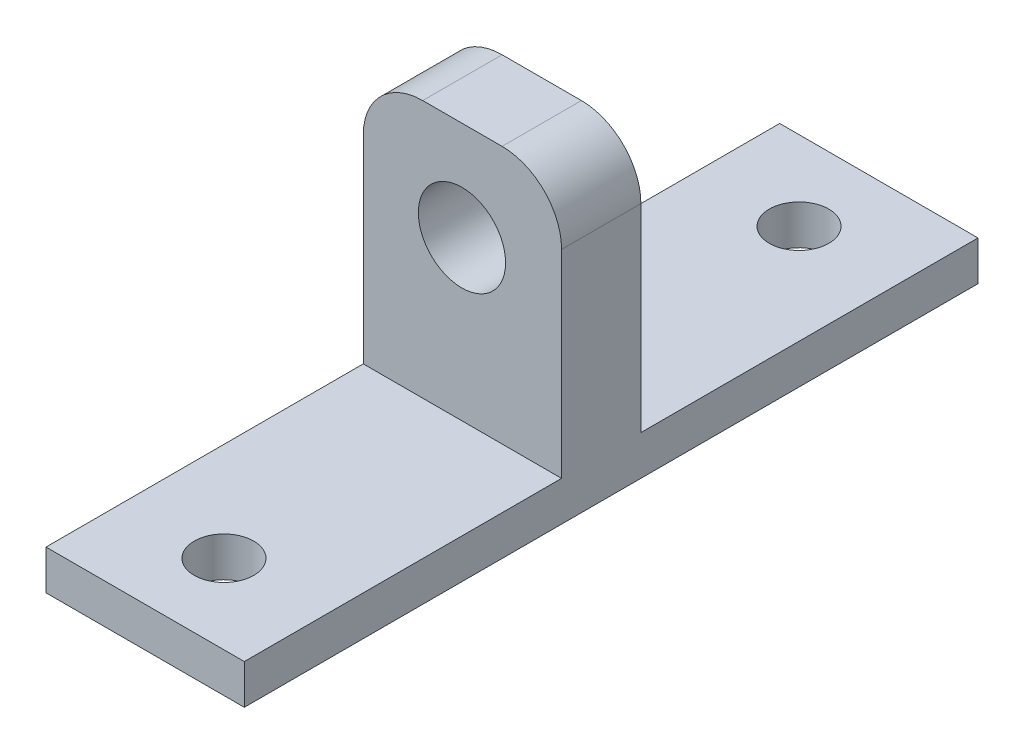
ISO-10303-21;
HEADER;
FILE_DESCRIPTION(('STEP AP214'),'2;1');
FILE_NAME('part.step','',(''),(''),'','','');
FILE_SCHEMA(('AUTOMOTIVE_DESIGN { 1 0 10303 214 1 1 1 1 }'));
ENDSEC;
DATA;
#1=APPLICATION_CONTEXT('core data for automotive mechanical design processes');
#2=APPLICATION_PROTOCOL_DEFINITION('international standard','automotive_design',2000,#1);
#3=PRODUCT_CONTEXT('',#1,'mechanical');
#4=PRODUCT('Part','Part','',(#3));
#5=PRODUCT_RELATED_PRODUCT_CATEGORY('part','',(#4));
#6=PRODUCT_DEFINITION_FORMATION('','',#4);
#7=PRODUCT_DEFINITION_CONTEXT('part definition',#1,'design');
#8=PRODUCT_DEFINITION('design','',#6,#7);
#9=PRODUCT_DEFINITION_SHAPE('','',#8);
#10=(LENGTH_UNIT() NAMED_UNIT(*) SI_UNIT(.MILLI.,.METRE.));
#11=(NAMED_UNIT(*) PLANE_ANGLE_UNIT() SI_UNIT($,.RADIAN.));
#12=(NAMED_UNIT(*) SI_UNIT($,.STERADIAN.) SOLID_ANGLE_UNIT());
#13=UNCERTAINTY_MEASURE_WITH_UNIT(LENGTH_MEASURE(1.E-05),#10,'distance_accuracy_value','');
#14=(GEOMETRIC_REPRESENTATION_CONTEXT(3) GLOBAL_UNCERTAINTY_ASSIGNED_CONTEXT((#13)) GLOBAL_UNIT_ASSIGNED_CONTEXT((#10,
#11,#12)) REPRESENTATION_CONTEXT('',''));
#15=CARTESIAN_POINT('',(0.,0.,0.));
#16=DIRECTION('',(0.,0.,1.));
#17=DIRECTION('',(1.,0.,0.));
#18=AXIS2_PLACEMENT_3D('',#15,#16,#17);
#19=CARTESIAN_POINT('',(0.,0.,4.));
#20=DIRECTION('',(0.,0.,1.));
#21=DIRECTION('',(1.,0.,0.));
#22=AXIS2_PLACEMENT_3D('',#19,#20,#21);
#23=PLANE('',#22);
#24=DIRECTION('',(0.,1.,0.));
#25=VECTOR('',#24,1.);
#26=CARTESIAN_POINT('',(5.0248332971654,5.,4.));
#27=LINE('',#26,#25);
#28=CARTESIAN_POINT('',(5.0248332971654,-8.,4.));
#29=VERTEX_POINT('',#28);
#30=CARTESIAN_POINT('',(5.0248332971654,2.,4.));
#31=VERTEX_POINT('',#30);
#32=EDGE_CURVE('E170',#29,#31,#27,.T.);
#33=ORIENTED_EDGE('',*,*,#32,.T.);
#34=CARTESIAN_POINT('',(2.0248332971654,2.,4.));
#35=DIRECTION('',(0.,0.,1.));
#36=DIRECTION('',(1.,0.,0.));
#37=AXIS2_PLACEMENT_3D('',#34,#35,#36);
#38=CIRCLE('',#37,3.);
#39=CARTESIAN_POINT('',(2.0248332971654,5.,4.));
#40=VERTEX_POINT('',#39);
#41=EDGE_CURVE('E219',#31,#40,#38,.T.);
#42=ORIENTED_EDGE('',*,*,#41,.T.);
#43=DIRECTION('',(-1.,0.,0.));
#44=VECTOR('',#43,1.);
#45=CARTESIAN_POINT('',(-4.9751667028346,5.,4.));
#46=LINE('',#45,#44);
#47=CARTESIAN_POINT('',(-1.9751667028346,5.,4.));
#48=VERTEX_POINT('',#47);
#49=EDGE_CURVE('E174',#40,#48,#46,.T.);
#50=ORIENTED_EDGE('',*,*,#49,.T.);
#51=CARTESIAN_POINT('',(-1.9751667028346,2.,4.));
#52=DIRECTION('',(0.,0.,1.));
#53=DIRECTION('',(1.,0.,0.));
#54=AXIS2_PLACEMENT_3D('',#51,#52,#53);
#55=CIRCLE('',#54,3.);
#56=CARTESIAN_POINT('',(-4.9751667028346,2.,4.));
#57=VERTEX_POINT('',#56);
#58=EDGE_CURVE('E216',#48,#57,#55,.T.);
#59=ORIENTED_EDGE('',*,*,#58,.T.);
#60=DIRECTION('',(0.,-1.,0.));
#61=VECTOR('',#60,1.);
#62=CARTESIAN_POINT('',(-4.9751667028346,0.,4.));
#63=LINE('',#62,#61);
#64=CARTESIAN_POINT('',(-4.97516670283459,-8.,4.));
#65=VERTEX_POINT('',#64);
#66=EDGE_CURVE('E179',#57,#65,#63,.T.);
#67=ORIENTED_EDGE('',*,*,#66,.T.);
#68=DIRECTION('',(1.,0.,0.));
#69=VECTOR('',#68,1.);
#70=CARTESIAN_POINT('',(-4.9751667028346,-8.,4.));
#71=LINE('',#70,#69);
#72=EDGE_CURVE('E183',#65,#29,#71,.T.);
#73=ORIENTED_EDGE('',*,*,#72,.T.);
#74=EDGE_LOOP('',(#33,#42,#50,#59,#67,#73));
#75=FACE_BOUND('',#74,.T.);
#76=CARTESIAN_POINT('',(0.,0.,4.));
#77=DIRECTION('',(0.,0.,1.));
#78=DIRECTION('',(1.,0.,0.));
#79=AXIS2_PLACEMENT_3D('',#76,#77,#78);
#80=CIRCLE('',#79,2.2);
#81=CARTESIAN_POINT('',(2.2,0.,4.));
#82=VERTEX_POINT('',#81);
#83=EDGE_CURVE('E162',#82,#82,#80,.T.);
#84=ORIENTED_EDGE('',*,*,#83,.F.);
#85=EDGE_LOOP('',(#84));
#86=FACE_BOUND('',#85,.T.);
#87=ADVANCED_FACE('F44',(#75,#86),#23,.T.);
#88=CARTESIAN_POINT('',(0.,0.,0.));
#89=DIRECTION('',(0.,0.,1.));
#90=DIRECTION('',(1.,0.,0.));
#91=AXIS2_PLACEMENT_3D('',#88,#89,#90);
#92=PLANE('',#91);
#93=DIRECTION('',(-1.,0.,0.));
#94=VECTOR('',#93,1.);
#95=CARTESIAN_POINT('',(-4.9751667028346,5.,0.));
#96=LINE('',#95,#94);
#97=CARTESIAN_POINT('',(2.0248332971654,5.,0.));
#98=VERTEX_POINT('',#97);
#99=CARTESIAN_POINT('',(-1.9751667028346,5.,0.));
#100=VERTEX_POINT('',#99);
#101=EDGE_CURVE('E166',#98,#100,#96,.T.);
#102=ORIENTED_EDGE('',*,*,#101,.F.);
#103=CARTESIAN_POINT('',(2.0248332971654,2.,0.));
#104=DIRECTION('',(0.,0.,1.));
#105=DIRECTION('',(1.,0.,0.));
#106=AXIS2_PLACEMENT_3D('',#103,#104,#105);
#107=CIRCLE('',#106,3.);
#108=CARTESIAN_POINT('',(5.0248332971654,2.,0.));
#109=VERTEX_POINT('',#108);
#110=EDGE_CURVE('E210',#98,#109,#107,.F.);
#111=ORIENTED_EDGE('',*,*,#110,.T.);
#112=DIRECTION('',(0.,1.,0.));
#113=VECTOR('',#112,1.);
#114=CARTESIAN_POINT('',(5.0248332971654,-8.,0.));
#115=LINE('',#114,#113);
#116=CARTESIAN_POINT('',(5.0248332971654,-8.,0.));
#117=VERTEX_POINT('',#116);
#118=EDGE_CURVE('E175',#117,#109,#115,.T.);
#119=ORIENTED_EDGE('',*,*,#118,.F.);
#120=DIRECTION('',(1.,0.,0.));
#121=VECTOR('',#120,1.);
#122=CARTESIAN_POINT('',(-4.9751667028346,-8.,0.));
#123=LINE('',#122,#121);
#124=CARTESIAN_POINT('',(-4.97516670283459,-8.,0.));
#125=VERTEX_POINT('',#124);
#126=EDGE_CURVE('E194',#125,#117,#123,.T.);
#127=ORIENTED_EDGE('',*,*,#126,.F.);
#128=DIRECTION('',(0.,-1.,0.));
#129=VECTOR('',#128,1.);
#130=CARTESIAN_POINT('',(-4.9751667028346,0.,0.));
#131=LINE('',#130,#129);
#132=CARTESIAN_POINT('',(-4.9751667028346,2.,0.));
#133=VERTEX_POINT('',#132);
#134=EDGE_CURVE('E191',#133,#125,#131,.T.);
#135=ORIENTED_EDGE('',*,*,#134,.F.);
#136=CARTESIAN_POINT('',(-1.9751667028346,2.,0.));
#137=DIRECTION('',(0.,0.,1.));
#138=DIRECTION('',(1.,0.,0.));
#139=AXIS2_PLACEMENT_3D('',#136,#137,#138);
#140=CIRCLE('',#139,3.);
#141=EDGE_CURVE('E207',#133,#100,#140,.F.);
#142=ORIENTED_EDGE('',*,*,#141,.T.);
#143=EDGE_LOOP('',(#102,#111,#119,#127,#135,#142));
#144=FACE_BOUND('',#143,.T.);
#145=CARTESIAN_POINT('',(0.,0.,0.));
#146=DIRECTION('',(0.,0.,1.));
#147=DIRECTION('',(1.,0.,0.));
#148=AXIS2_PLACEMENT_3D('',#145,#146,#147);
#149=CIRCLE('',#148,2.2);
#150=CARTESIAN_POINT('',(2.2,0.,0.));
#151=VERTEX_POINT('',#150);
#152=EDGE_CURVE('E150',#151,#151,#149,.T.);
#153=ORIENTED_EDGE('',*,*,#152,.T.);
#154=EDGE_LOOP('',(#153));
#155=FACE_BOUND('',#154,.T.);
#156=ADVANCED_FACE('F236',(#144,#155),#92,.F.);
#157=CARTESIAN_POINT('',(-4.9751667028346,5.,4.));
#158=DIRECTION('',(0.,-1.,0.));
#159=DIRECTION('',(0.,0.,-1.));
#160=AXIS2_PLACEMENT_3D('',#157,#158,#159);
#161=PLANE('',#160);
#162=ORIENTED_EDGE('',*,*,#49,.F.);
#163=DIRECTION('',(0.,0.,-1.));
#164=VECTOR('',#163,1.);
#165=CARTESIAN_POINT('',(2.0248332971654,5.,4.));
#166=LINE('',#165,#164);
#167=EDGE_CURVE('E203',#40,#98,#166,.T.);
#168=ORIENTED_EDGE('',*,*,#167,.T.);
#169=ORIENTED_EDGE('',*,*,#101,.T.);
#170=DIRECTION('',(0.,0.,-1.));
#171=VECTOR('',#170,1.);
#172=CARTESIAN_POINT('',(-1.9751667028346,5.,4.));
#173=LINE('',#172,#171);
#174=EDGE_CURVE('E187',#100,#48,#173,.F.);
#175=ORIENTED_EDGE('',*,*,#174,.T.);
#176=EDGE_LOOP('',(#162,#168,#169,#175));
#177=FACE_BOUND('',#176,.T.);
#178=ADVANCED_FACE('F353',(#177),#161,.F.);
#179=CARTESIAN_POINT('',(-4.9751667028346,0.,4.));
#180=DIRECTION('',(1.,0.,0.));
#181=DIRECTION('',(0.,1.,0.));
#182=AXIS2_PLACEMENT_3D('',#179,#180,#181);
#183=PLANE('',#182);
#184=DIRECTION('',(0.,0.,-1.));
#185=VECTOR('',#184,1.);
#186=CARTESIAN_POINT('',(-4.97516670283459,-10.,-18.));
#187=LINE('',#186,#185);
#188=CARTESIAN_POINT('',(-4.97516670283459,-10.,20.));
#189=VERTEX_POINT('',#188);
#190=CARTESIAN_POINT('',(-4.97516670283459,-10.,-17.));
#191=VERTEX_POINT('',#190);
#192=EDGE_CURVE('E145',#189,#191,#187,.T.);
#193=ORIENTED_EDGE('',*,*,#192,.F.);
#194=DIRECTION('',(0.,-1.,0.));
#195=VECTOR('',#194,1.);
#196=CARTESIAN_POINT('',(-4.97516670283459,0.,20.));
#197=LINE('',#196,#195);
#198=CARTESIAN_POINT('',(-4.97516670283459,-8.,20.));
#199=VERTEX_POINT('',#198);
#200=EDGE_CURVE('E60',#199,#189,#197,.T.);
#201=ORIENTED_EDGE('',*,*,#200,.F.);
#202=DIRECTION('',(0.,0.,-1.));
#203=VECTOR('',#202,1.);
#204=CARTESIAN_POINT('',(-4.97516670283459,-8.,-18.));
#205=LINE('',#204,#203);
#206=EDGE_CURVE('E158',#199,#65,#205,.T.);
#207=ORIENTED_EDGE('',*,*,#206,.T.);
#208=ORIENTED_EDGE('',*,*,#66,.F.);
#209=DIRECTION('',(0.,0.,-1.));
#210=VECTOR('',#209,1.);
#211=CARTESIAN_POINT('',(-4.9751667028346,2.,4.));
#212=LINE('',#211,#210);
#213=EDGE_CURVE('E53',#57,#133,#212,.T.);
#214=ORIENTED_EDGE('',*,*,#213,.T.);
#215=ORIENTED_EDGE('',*,*,#134,.T.);
#216=CARTESIAN_POINT('',(-4.97516670283459,-8.,-17.));
#217=VERTEX_POINT('',#216);
#218=EDGE_CURVE('E160',#125,#217,#205,.T.);
#219=ORIENTED_EDGE('',*,*,#218,.T.);
#220=DIRECTION('',(0.,-1.,0.));
#221=VECTOR('',#220,1.);
#222=CARTESIAN_POINT('',(-4.97516670283459,0.,-17.));
#223=LINE('',#222,#221);
#224=EDGE_CURVE('E67',#217,#191,#223,.T.);
#225=ORIENTED_EDGE('',*,*,#224,.T.);
#226=EDGE_LOOP('',(#193,#201,#207,#208,#214,#215,#219,#225));
#227=FACE_BOUND('',#226,.T.);
#228=ADVANCED_FACE('F228',(#227),#183,.F.);
#229=CARTESIAN_POINT('',(5.0248332971654,-8.,4.));
#230=DIRECTION('',(-1.,0.,0.));
#231=DIRECTION('',(0.,-1.,0.));
#232=AXIS2_PLACEMENT_3D('',#229,#230,#231);
#233=PLANE('',#232);
#234=DIRECTION('',(0.,0.,1.));
#235=VECTOR('',#234,1.);
#236=CARTESIAN_POINT('',(5.0248332971654,-8.,0.));
#237=LINE('',#236,#235);
#238=CARTESIAN_POINT('',(5.02483329716541,-8.,20.));
#239=VERTEX_POINT('',#238);
#240=EDGE_CURVE('E136',#29,#239,#237,.T.);
#241=ORIENTED_EDGE('',*,*,#240,.T.);
#242=DIRECTION('',(0.,-1.,0.));
#243=VECTOR('',#242,1.);
#244=CARTESIAN_POINT('',(5.02483329716541,0.,20.));
#245=LINE('',#244,#243);
#246=CARTESIAN_POINT('',(5.02483329716541,-10.,20.));
#247=VERTEX_POINT('',#246);
#248=EDGE_CURVE('E121',#239,#247,#245,.T.);
#249=ORIENTED_EDGE('',*,*,#248,.T.);
#250=DIRECTION('',(0.,0.,1.));
#251=VECTOR('',#250,1.);
#252=CARTESIAN_POINT('',(5.0248332971654,-10.,21.));
#253=LINE('',#252,#251);
#254=CARTESIAN_POINT('',(5.02483329716541,-10.,-17.));
#255=VERTEX_POINT('',#254);
#256=EDGE_CURVE('E134',#255,#247,#253,.T.);
#257=ORIENTED_EDGE('',*,*,#256,.F.);
#258=DIRECTION('',(0.,-1.,0.));
#259=VECTOR('',#258,1.);
#260=CARTESIAN_POINT('',(5.02483329716541,0.,-17.));
#261=LINE('',#260,#259);
#262=CARTESIAN_POINT('',(5.02483329716541,-8.,-17.));
#263=VERTEX_POINT('',#262);
#264=EDGE_CURVE('E265',#263,#255,#261,.T.);
#265=ORIENTED_EDGE('',*,*,#264,.F.);
#266=EDGE_CURVE('E146',#263,#117,#237,.T.);
#267=ORIENTED_EDGE('',*,*,#266,.T.);
#268=ORIENTED_EDGE('',*,*,#118,.T.);
#269=DIRECTION('',(0.,0.,-1.));
#270=VECTOR('',#269,1.);
#271=CARTESIAN_POINT('',(5.0248332971654,2.,4.));
#272=LINE('',#271,#270);
#273=EDGE_CURVE('E213',#109,#31,#272,.F.);
#274=ORIENTED_EDGE('',*,*,#273,.T.);
#275=ORIENTED_EDGE('',*,*,#32,.F.);
#276=EDGE_LOOP('',(#241,#249,#257,#265,#267,#268,#274,#275));
#277=FACE_BOUND('',#276,.T.);
#278=ADVANCED_FACE('F132',(#277),#233,.F.);
#279=CARTESIAN_POINT('',(0.,0.,4.));
#280=DIRECTION('',(0.,0.,-1.));
#281=DIRECTION('',(-1.,0.,0.));
#282=AXIS2_PLACEMENT_3D('',#279,#280,#281);
#283=CYLINDRICAL_SURFACE('',#282,2.2);
#284=ORIENTED_EDGE('',*,*,#83,.T.);
#285=EDGE_LOOP('',(#284));
#286=FACE_BOUND('',#285,.T.);
#287=ORIENTED_EDGE('',*,*,#152,.F.);
#288=EDGE_LOOP('',(#287));
#289=FACE_BOUND('',#288,.T.);
#290=ADVANCED_FACE('F375',(#286,#289),#283,.F.);
#291=CARTESIAN_POINT('',(0.,-8.,0.));
#292=DIRECTION('',(0.,1.,0.));
#293=DIRECTION('',(0.,0.,1.));
#294=AXIS2_PLACEMENT_3D('',#291,#292,#293);
#295=PLANE('',#294);
#296=DIRECTION('',(-1.,0.,0.));
#297=VECTOR('',#296,1.);
#298=CARTESIAN_POINT('',(0.,-8.,20.));
#299=LINE('',#298,#297);
#300=EDGE_CURVE('E138',#239,#199,#299,.T.);
#301=ORIENTED_EDGE('',*,*,#300,.F.);
#302=ORIENTED_EDGE('',*,*,#240,.F.);
#303=ORIENTED_EDGE('',*,*,#72,.F.);
#304=ORIENTED_EDGE('',*,*,#206,.F.);
#305=EDGE_LOOP('',(#301,#302,#303,#304));
#306=FACE_BOUND('',#305,.T.);
#307=CARTESIAN_POINT('',(0.,-8.,16.));
#308=DIRECTION('',(0.,-1.,0.));
#309=DIRECTION('',(0.,0.,1.));
#310=AXIS2_PLACEMENT_3D('',#307,#308,#309);
#311=CIRCLE('',#310,1.5);
#312=CARTESIAN_POINT('',(0.,-8.,17.5));
#313=VERTEX_POINT('',#312);
#314=EDGE_CURVE('E256',#313,#313,#311,.T.);
#315=ORIENTED_EDGE('',*,*,#314,.T.);
#316=EDGE_LOOP('',(#315));
#317=FACE_BOUND('',#316,.T.);
#318=ADVANCED_FACE('F345',(#306,#317),#295,.T.);
#319=CARTESIAN_POINT('',(0.,-10.,0.));
#320=DIRECTION('',(0.,1.,0.));
#321=DIRECTION('',(0.,0.,1.));
#322=AXIS2_PLACEMENT_3D('',#319,#320,#321);
#323=PLANE('',#322);
#324=ORIENTED_EDGE('',*,*,#256,.T.);
#325=DIRECTION('',(1.,0.,0.));
#326=VECTOR('',#325,1.);
#327=CARTESIAN_POINT('',(-4.97516670283459,-10.,20.));
#328=LINE('',#327,#326);
#329=EDGE_CURVE('E118',#189,#247,#328,.T.);
#330=ORIENTED_EDGE('',*,*,#329,.F.);
#331=ORIENTED_EDGE('',*,*,#192,.T.);
#332=DIRECTION('',(-1.,0.,0.));
#333=VECTOR('',#332,1.);
#334=CARTESIAN_POINT('',(-4.97516670283459,-10.,-17.));
#335=LINE('',#334,#333);
#336=EDGE_CURVE('E143',#255,#191,#335,.T.);
#337=ORIENTED_EDGE('',*,*,#336,.F.);
#338=EDGE_LOOP('',(#324,#330,#331,#337));
#339=FACE_BOUND('',#338,.T.);
#340=CARTESIAN_POINT('',(0.,-10.,-13.));
#341=DIRECTION('',(0.,-1.,0.));
#342=DIRECTION('',(0.,0.,-1.));
#343=AXIS2_PLACEMENT_3D('',#340,#341,#342);
#344=CIRCLE('',#343,1.5);
#345=CARTESIAN_POINT('',(0.,-10.,-14.5));
#346=VERTEX_POINT('',#345);
#347=EDGE_CURVE('E244',#346,#346,#344,.T.);
#348=ORIENTED_EDGE('',*,*,#347,.F.);
#349=EDGE_LOOP('',(#348));
#350=FACE_BOUND('',#349,.T.);
#351=CARTESIAN_POINT('',(0.,-10.,16.));
#352=DIRECTION('',(0.,-1.,0.));
#353=DIRECTION('',(0.,0.,1.));
#354=AXIS2_PLACEMENT_3D('',#351,#352,#353);
#355=CIRCLE('',#354,1.5);
#356=CARTESIAN_POINT('',(0.,-10.,17.5));
#357=VERTEX_POINT('',#356);
#358=EDGE_CURVE('E254',#357,#357,#355,.T.);
#359=ORIENTED_EDGE('',*,*,#358,.F.);
#360=EDGE_LOOP('',(#359));
#361=FACE_BOUND('',#360,.T.);
#362=ADVANCED_FACE('F141',(#339,#350,#361),#323,.F.);
#363=DIRECTION('',(1.,0.,0.));
#364=VECTOR('',#363,1.);
#365=CARTESIAN_POINT('',(0.,-8.,-17.));
#366=LINE('',#365,#364);
#367=EDGE_CURVE('E11',#217,#263,#366,.T.);
#368=ORIENTED_EDGE('',*,*,#367,.F.);
#369=ORIENTED_EDGE('',*,*,#218,.F.);
#370=ORIENTED_EDGE('',*,*,#126,.T.);
#371=ORIENTED_EDGE('',*,*,#266,.F.);
#372=EDGE_LOOP('',(#368,#369,#370,#371));
#373=FACE_BOUND('',#372,.T.);
#374=CARTESIAN_POINT('',(0.,-8.,-13.));
#375=DIRECTION('',(0.,-1.,0.));
#376=DIRECTION('',(0.,0.,-1.));
#377=AXIS2_PLACEMENT_3D('',#374,#375,#376);
#378=CIRCLE('',#377,1.5);
#379=CARTESIAN_POINT('',(0.,-8.,-14.5));
#380=VERTEX_POINT('',#379);
#381=EDGE_CURVE('E155',#380,#380,#378,.T.);
#382=ORIENTED_EDGE('',*,*,#381,.T.);
#383=EDGE_LOOP('',(#382));
#384=FACE_BOUND('',#383,.T.);
#385=ADVANCED_FACE('F241',(#373,#384),#295,.T.);
#386=CARTESIAN_POINT('',(0.,-10.,-13.));
#387=DIRECTION('',(0.,1.,0.));
#388=DIRECTION('',(0.,0.,1.));
#389=AXIS2_PLACEMENT_3D('',#386,#387,#388);
#390=CYLINDRICAL_SURFACE('',#389,1.5);
#391=ORIENTED_EDGE('',*,*,#347,.T.);
#392=EDGE_LOOP('',(#391));
#393=FACE_BOUND('',#392,.T.);
#394=ORIENTED_EDGE('',*,*,#381,.F.);
#395=EDGE_LOOP('',(#394));
#396=FACE_BOUND('',#395,.T.);
#397=ADVANCED_FACE('F364',(#393,#396),#390,.F.);
#398=CARTESIAN_POINT('',(0.,-10.,16.));
#399=DIRECTION('',(0.,1.,0.));
#400=DIRECTION('',(0.,0.,1.));
#401=AXIS2_PLACEMENT_3D('',#398,#399,#400);
#402=CYLINDRICAL_SURFACE('',#401,1.5);
#403=ORIENTED_EDGE('',*,*,#358,.T.);
#404=EDGE_LOOP('',(#403));
#405=FACE_BOUND('',#404,.T.);
#406=ORIENTED_EDGE('',*,*,#314,.F.);
#407=EDGE_LOOP('',(#406));
#408=FACE_BOUND('',#407,.T.);
#409=ADVANCED_FACE('F359',(#405,#408),#402,.F.);
#410=CARTESIAN_POINT('',(2.0248332971654,2.,4.));
#411=DIRECTION('',(0.,0.,-1.));
#412=DIRECTION('',(-1.,0.,0.));
#413=AXIS2_PLACEMENT_3D('',#410,#411,#412);
#414=CYLINDRICAL_SURFACE('',#413,3.);
#415=ORIENTED_EDGE('',*,*,#41,.F.);
#416=ORIENTED_EDGE('',*,*,#273,.F.);
#417=ORIENTED_EDGE('',*,*,#110,.F.);
#418=ORIENTED_EDGE('',*,*,#167,.F.);
#419=EDGE_LOOP('',(#415,#416,#417,#418));
#420=FACE_BOUND('',#419,.T.);
#421=ADVANCED_FACE('F357',(#420),#414,.T.);
#422=CARTESIAN_POINT('',(-1.9751667028346,2.,4.));
#423=DIRECTION('',(0.,0.,-1.));
#424=DIRECTION('',(-1.,0.,0.));
#425=AXIS2_PLACEMENT_3D('',#422,#423,#424);
#426=CYLINDRICAL_SURFACE('',#425,3.);
#427=ORIENTED_EDGE('',*,*,#58,.F.);
#428=ORIENTED_EDGE('',*,*,#174,.F.);
#429=ORIENTED_EDGE('',*,*,#141,.F.);
#430=ORIENTED_EDGE('',*,*,#213,.F.);
#431=EDGE_LOOP('',(#427,#428,#429,#430));
#432=FACE_BOUND('',#431,.T.);
#433=ADVANCED_FACE('F46',(#432),#426,.T.);
#434=CARTESIAN_POINT('',(-4.97516670283459,0.,-17.));
#435=DIRECTION('',(0.,0.,1.));
#436=DIRECTION('',(1.,0.,0.));
#437=AXIS2_PLACEMENT_3D('',#434,#435,#436);
#438=PLANE('',#437);
#439=ORIENTED_EDGE('',*,*,#367,.T.);
#440=ORIENTED_EDGE('',*,*,#264,.T.);
#441=ORIENTED_EDGE('',*,*,#336,.T.);
#442=ORIENTED_EDGE('',*,*,#224,.F.);
#443=EDGE_LOOP('',(#439,#440,#441,#442));
#444=FACE_BOUND('',#443,.T.);
#445=ADVANCED_FACE('F341',(#444),#438,.F.);
#446=CARTESIAN_POINT('',(-4.97516670283459,0.,20.));
#447=DIRECTION('',(0.,0.,-1.));
#448=DIRECTION('',(-1.,0.,0.));
#449=AXIS2_PLACEMENT_3D('',#446,#447,#448);
#450=PLANE('',#449);
#451=ORIENTED_EDGE('',*,*,#300,.T.);
#452=ORIENTED_EDGE('',*,*,#200,.T.);
#453=ORIENTED_EDGE('',*,*,#329,.T.);
#454=ORIENTED_EDGE('',*,*,#248,.F.);
#455=EDGE_LOOP('',(#451,#452,#453,#454));
#456=FACE_BOUND('',#455,.T.);
#457=ADVANCED_FACE('F120',(#456),#450,.F.);
#458=CLOSED_SHELL('',(#87,#156,#178,#228,#278,#290,#318,#362,#385,#397,#409,#421,#433,#445,#457));
#459=MANIFOLD_SOLID_BREP('B2',#458);
#460=ADVANCED_BREP_SHAPE_REPRESENTATION('',(#18,#459),#14);
#461=SHAPE_DEFINITION_REPRESENTATION(#9,#460);
ENDSEC;
END-ISO-10303-21;
